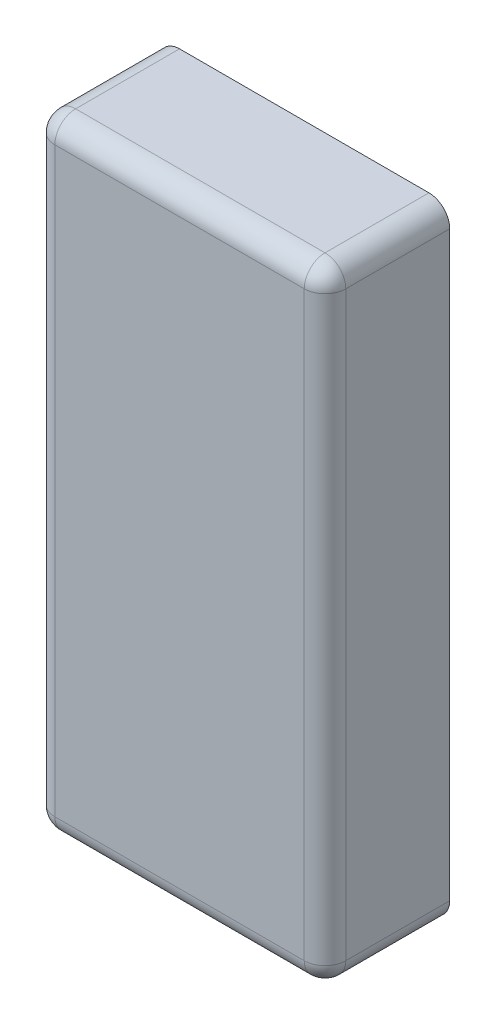
ISO-10303-21;
HEADER;
FILE_DESCRIPTION(('STEP AP214'),'2;1');
FILE_NAME('part.step','',(''),(''),'','','');
FILE_SCHEMA(('AUTOMOTIVE_DESIGN { 1 0 10303 214 1 1 1 1 }'));
ENDSEC;
DATA;
#1=APPLICATION_CONTEXT('core data for automotive mechanical design processes');
#2=APPLICATION_PROTOCOL_DEFINITION('international standard','automotive_design',2000,#1);
#3=PRODUCT_CONTEXT('',#1,'mechanical');
#4=PRODUCT('Part','Part','',(#3));
#5=PRODUCT_RELATED_PRODUCT_CATEGORY('part','',(#4));
#6=PRODUCT_DEFINITION_FORMATION('','',#4);
#7=PRODUCT_DEFINITION_CONTEXT('part definition',#1,'design');
#8=PRODUCT_DEFINITION('design','',#6,#7);
#9=PRODUCT_DEFINITION_SHAPE('','',#8);
#10=(LENGTH_UNIT() NAMED_UNIT(*) SI_UNIT(.MILLI.,.METRE.));
#11=(NAMED_UNIT(*) PLANE_ANGLE_UNIT() SI_UNIT($,.RADIAN.));
#12=(NAMED_UNIT(*) SI_UNIT($,.STERADIAN.) SOLID_ANGLE_UNIT());
#13=UNCERTAINTY_MEASURE_WITH_UNIT(LENGTH_MEASURE(1.E-05),#10,'distance_accuracy_value','');
#14=(GEOMETRIC_REPRESENTATION_CONTEXT(3) GLOBAL_UNCERTAINTY_ASSIGNED_CONTEXT((#13)) GLOBAL_UNIT_ASSIGNED_CONTEXT((#10,
#11,#12)) REPRESENTATION_CONTEXT('',''));
#15=CARTESIAN_POINT('',(0.,0.,0.));
#16=DIRECTION('',(0.,0.,1.));
#17=DIRECTION('',(1.,0.,0.));
#18=AXIS2_PLACEMENT_3D('',#15,#16,#17);
#19=CARTESIAN_POINT('',(9.110692596436,-0.142632293701,2.918495283666E-06));
#20=DIRECTION('',(0.,1.,0.));
#21=DIRECTION('',(1.,0.,0.));
#22=AXIS2_PLACEMENT_3D('',#19,#20,#21);
#23=PLANE('',#22);
#24=DIRECTION('',(1.,0.,0.));
#25=VECTOR('',#24,1.);
#26=CARTESIAN_POINT('',(9.110692596436,-0.142632293701,2.918495283666E-06));
#27=LINE('',#26,#25);
#28=CARTESIAN_POINT('',(9.210692596436,-0.142632293701,2.918495283666E-06));
#29=VERTEX_POINT('',#28);
#30=CARTESIAN_POINT('',(10.410692596436,-0.142632293701,2.918495283666E-06));
#31=VERTEX_POINT('',#30);
#32=EDGE_CURVE('E40',#29,#31,#27,.T.);
#33=ORIENTED_EDGE('',*,*,#32,.F.);
#34=DIRECTION('',(0.,0.,1.));
#35=VECTOR('',#34,1.);
#36=CARTESIAN_POINT('',(9.210692596436,-0.142632293701,2.918495283666E-06));
#37=LINE('',#36,#35);
#38=CARTESIAN_POINT('',(9.210692596436,-0.142632293701,0.500002918495));
#39=VERTEX_POINT('',#38);
#40=EDGE_CURVE('E11',#29,#39,#37,.T.);
#41=ORIENTED_EDGE('',*,*,#40,.T.);
#42=DIRECTION('',(1.,0.,0.));
#43=VECTOR('',#42,1.);
#44=CARTESIAN_POINT('',(9.110692596436,-0.142632293701,0.500002918495));
#45=LINE('',#44,#43);
#46=CARTESIAN_POINT('',(10.410692596436,-0.142632293701,0.500002918495));
#47=VERTEX_POINT('',#46);
#48=EDGE_CURVE('E27',#39,#47,#45,.T.);
#49=ORIENTED_EDGE('',*,*,#48,.T.);
#50=DIRECTION('',(0.,0.,1.));
#51=VECTOR('',#50,1.);
#52=CARTESIAN_POINT('',(10.410692596436,-0.142632293701,2.918495283666E-06));
#53=LINE('',#52,#51);
#54=EDGE_CURVE('E196',#31,#47,#53,.T.);
#55=ORIENTED_EDGE('',*,*,#54,.F.);
#56=EDGE_LOOP('',(#33,#41,#49,#55));
#57=FACE_BOUND('',#56,.T.);
#58=ADVANCED_FACE('F16',(#57),#23,.T.);
#59=CARTESIAN_POINT('',(9.810692596436,-1.642632293701,2.918495283666E-06));
#60=DIRECTION('',(0.,0.,1.));
#61=DIRECTION('',(1.,0.,0.));
#62=AXIS2_PLACEMENT_3D('',#59,#60,#61);
#63=PLANE('',#62);
#64=CARTESIAN_POINT('',(10.410692596436,-0.242632293701,2.918495283666E-06));
#65=DIRECTION('',(0.,0.,-1.));
#66=DIRECTION('',(0.,-1.,0.));
#67=AXIS2_PLACEMENT_3D('',#64,#65,#66);
#68=CIRCLE('',#67,0.1);
#69=CARTESIAN_POINT('',(10.510692596436,-0.242632293701,2.918495283666E-06));
#70=VERTEX_POINT('',#69);
#71=EDGE_CURVE('E235',#31,#70,#68,.T.);
#72=ORIENTED_EDGE('',*,*,#71,.T.);
#73=DIRECTION('',(0.,-1.,0.));
#74=VECTOR('',#73,1.);
#75=CARTESIAN_POINT('',(10.510692596436,-0.142632293701,2.918495283666E-06));
#76=LINE('',#75,#74);
#77=CARTESIAN_POINT('',(10.510692596436,-3.042632293701,2.918495283666E-06));
#78=VERTEX_POINT('',#77);
#79=EDGE_CURVE('E132',#70,#78,#76,.T.);
#80=ORIENTED_EDGE('',*,*,#79,.T.);
#81=CARTESIAN_POINT('',(10.410692596436,-3.042632293701,2.918495283666E-06));
#82=DIRECTION('',(0.,0.,-1.));
#83=DIRECTION('',(0.,-1.,0.));
#84=AXIS2_PLACEMENT_3D('',#81,#82,#83);
#85=CIRCLE('',#84,0.1);
#86=CARTESIAN_POINT('',(10.410692596436,-3.142632293701,2.918495283666E-06));
#87=VERTEX_POINT('',#86);
#88=EDGE_CURVE('E126',#78,#87,#85,.T.);
#89=ORIENTED_EDGE('',*,*,#88,.T.);
#90=DIRECTION('',(-1.,0.,0.));
#91=VECTOR('',#90,1.);
#92=CARTESIAN_POINT('',(10.510692596436,-3.142632293701,2.918495283666E-06));
#93=LINE('',#92,#91);
#94=CARTESIAN_POINT('',(9.210692596436,-3.142632293701,2.918495283666E-06));
#95=VERTEX_POINT('',#94);
#96=EDGE_CURVE('E115',#87,#95,#93,.T.);
#97=ORIENTED_EDGE('',*,*,#96,.T.);
#98=CARTESIAN_POINT('',(9.210692596436,-3.042632293701,2.918495283666E-06));
#99=DIRECTION('',(0.,0.,-1.));
#100=DIRECTION('',(0.,-1.,0.));
#101=AXIS2_PLACEMENT_3D('',#98,#99,#100);
#102=CIRCLE('',#101,0.1);
#103=CARTESIAN_POINT('',(9.110692596436,-3.042632293701,2.918495283666E-06));
#104=VERTEX_POINT('',#103);
#105=EDGE_CURVE('E127',#95,#104,#102,.T.);
#106=ORIENTED_EDGE('',*,*,#105,.T.);
#107=DIRECTION('',(0.,1.,0.));
#108=VECTOR('',#107,1.);
#109=CARTESIAN_POINT('',(9.110692596436,-3.142632293701,2.918495283666E-06));
#110=LINE('',#109,#108);
#111=CARTESIAN_POINT('',(9.110692596436,-0.242632293701,2.918495283666E-06));
#112=VERTEX_POINT('',#111);
#113=EDGE_CURVE('E190',#104,#112,#110,.T.);
#114=ORIENTED_EDGE('',*,*,#113,.T.);
#115=CARTESIAN_POINT('',(9.210692596436,-0.242632293701,2.918495283666E-06));
#116=DIRECTION('',(0.,0.,1.));
#117=DIRECTION('',(0.,-1.,0.));
#118=AXIS2_PLACEMENT_3D('',#115,#116,#117);
#119=CIRCLE('',#118,0.1);
#120=EDGE_CURVE('E195',#29,#112,#119,.T.);
#121=ORIENTED_EDGE('',*,*,#120,.F.);
#122=ORIENTED_EDGE('',*,*,#32,.T.);
#123=EDGE_LOOP('',(#72,#80,#89,#97,#106,#114,#121,#122));
#124=FACE_BOUND('',#123,.T.);
#125=ADVANCED_FACE('F131',(#124),#63,.F.);
#126=CARTESIAN_POINT('',(9.210692596436,-0.242632293701,2.918495283666E-06));
#127=DIRECTION('',(0.,0.,1.));
#128=DIRECTION('',(0.,1.,0.));
#129=AXIS2_PLACEMENT_3D('',#126,#127,#128);
#130=CYLINDRICAL_SURFACE('',#129,0.1);
#131=ORIENTED_EDGE('',*,*,#120,.T.);
#132=DIRECTION('',(0.,0.,1.));
#133=VECTOR('',#132,1.);
#134=CARTESIAN_POINT('',(9.110692596436,-0.242632293701,2.918495283666E-06));
#135=LINE('',#134,#133);
#136=CARTESIAN_POINT('',(9.110692596436,-0.242632293701,0.500002918495));
#137=VERTEX_POINT('',#136);
#138=EDGE_CURVE('E191',#112,#137,#135,.T.);
#139=ORIENTED_EDGE('',*,*,#138,.T.);
#140=CARTESIAN_POINT('',(9.210692596436,-0.242632293701,0.500002918495));
#141=DIRECTION('',(0.,0.,1.));
#142=DIRECTION('',(0.,1.,0.));
#143=AXIS2_PLACEMENT_3D('',#140,#141,#142);
#144=CIRCLE('',#143,0.1);
#145=EDGE_CURVE('E152',#39,#137,#144,.T.);
#146=ORIENTED_EDGE('',*,*,#145,.F.);
#147=ORIENTED_EDGE('',*,*,#40,.F.);
#148=EDGE_LOOP('',(#131,#139,#146,#147));
#149=FACE_BOUND('',#148,.T.);
#150=ADVANCED_FACE('F352',(#149),#130,.T.);
#151=CARTESIAN_POINT('',(10.410692596436,-0.242632293701,2.918495283666E-06));
#152=DIRECTION('',(0.,0.,1.));
#153=DIRECTION('',(0.,1.,0.));
#154=AXIS2_PLACEMENT_3D('',#151,#152,#153);
#155=CYLINDRICAL_SURFACE('',#154,0.1);
#156=ORIENTED_EDGE('',*,*,#54,.T.);
#157=CARTESIAN_POINT('',(10.410692596436,-0.242632293701,0.500002918495));
#158=DIRECTION('',(0.,0.,1.));
#159=DIRECTION('',(0.,1.,0.));
#160=AXIS2_PLACEMENT_3D('',#157,#158,#159);
#161=CIRCLE('',#160,0.1);
#162=CARTESIAN_POINT('',(10.510692596436,-0.242632293701,0.500002918495));
#163=VERTEX_POINT('',#162);
#164=EDGE_CURVE('E161',#163,#47,#161,.T.);
#165=ORIENTED_EDGE('',*,*,#164,.F.);
#166=DIRECTION('',(0.,0.,1.));
#167=VECTOR('',#166,1.);
#168=CARTESIAN_POINT('',(10.510692596436,-0.242632293701,2.918495283666E-06));
#169=LINE('',#168,#167);
#170=EDGE_CURVE('E20',#70,#163,#169,.T.);
#171=ORIENTED_EDGE('',*,*,#170,.F.);
#172=ORIENTED_EDGE('',*,*,#71,.F.);
#173=EDGE_LOOP('',(#156,#165,#171,#172));
#174=FACE_BOUND('',#173,.T.);
#175=ADVANCED_FACE('F272',(#174),#155,.T.);
#176=CARTESIAN_POINT('',(9.110692596436,-0.242632293701,0.500002918495));
#177=DIRECTION('',(1.,0.,0.));
#178=DIRECTION('',(0.,1.,0.));
#179=AXIS2_PLACEMENT_3D('',#176,#177,#178);
#180=CYLINDRICAL_SURFACE('',#179,0.1);
#181=CARTESIAN_POINT('',(9.210692596436,-0.242632293701,0.500002918495));
#182=DIRECTION('',(-1.,0.,0.));
#183=DIRECTION('',(0.,1.,0.));
#184=AXIS2_PLACEMENT_3D('',#181,#182,#183);
#185=CIRCLE('',#184,0.1);
#186=CARTESIAN_POINT('',(9.210692596436,-0.242632293701,0.600002918495));
#187=VERTEX_POINT('',#186);
#188=EDGE_CURVE('E160',#187,#39,#185,.T.);
#189=ORIENTED_EDGE('',*,*,#188,.F.);
#190=DIRECTION('',(1.,0.,0.));
#191=VECTOR('',#190,1.);
#192=CARTESIAN_POINT('',(9.110692596436,-0.242632293701,0.600002918495));
#193=LINE('',#192,#191);
#194=CARTESIAN_POINT('',(10.410692596436,-0.242632293701,0.600002918495));
#195=VERTEX_POINT('',#194);
#196=EDGE_CURVE('E209',#187,#195,#193,.T.);
#197=ORIENTED_EDGE('',*,*,#196,.T.);
#198=CARTESIAN_POINT('',(10.410692596436,-0.242632293701,0.500002918495));
#199=DIRECTION('',(1.,0.,0.));
#200=DIRECTION('',(0.,1.,0.));
#201=AXIS2_PLACEMENT_3D('',#198,#199,#200);
#202=CIRCLE('',#201,0.1);
#203=EDGE_CURVE('E157',#47,#195,#202,.T.);
#204=ORIENTED_EDGE('',*,*,#203,.F.);
#205=ORIENTED_EDGE('',*,*,#48,.F.);
#206=EDGE_LOOP('',(#189,#197,#204,#205));
#207=FACE_BOUND('',#206,.T.);
#208=ADVANCED_FACE('F18',(#207),#180,.T.);
#209=CARTESIAN_POINT('',(9.110692596436,-3.142632293701,2.918495283666E-06));
#210=DIRECTION('',(-1.,0.,0.));
#211=DIRECTION('',(0.,0.,1.));
#212=AXIS2_PLACEMENT_3D('',#209,#210,#211);
#213=PLANE('',#212);
#214=ORIENTED_EDGE('',*,*,#113,.F.);
#215=DIRECTION('',(0.,0.,1.));
#216=VECTOR('',#215,1.);
#217=CARTESIAN_POINT('',(9.110692596436,-3.042632293701,2.918495283666E-06));
#218=LINE('',#217,#216);
#219=CARTESIAN_POINT('',(9.110692596436,-3.042632293701,0.500002918495));
#220=VERTEX_POINT('',#219);
#221=EDGE_CURVE('E206',#104,#220,#218,.T.);
#222=ORIENTED_EDGE('',*,*,#221,.T.);
#223=DIRECTION('',(0.,1.,0.));
#224=VECTOR('',#223,1.);
#225=CARTESIAN_POINT('',(9.110692596436,-3.142632293701,0.500002918495));
#226=LINE('',#225,#224);
#227=EDGE_CURVE('E210',#220,#137,#226,.T.);
#228=ORIENTED_EDGE('',*,*,#227,.T.);
#229=ORIENTED_EDGE('',*,*,#138,.F.);
#230=EDGE_LOOP('',(#214,#222,#228,#229));
#231=FACE_BOUND('',#230,.T.);
#232=ADVANCED_FACE('F298',(#231),#213,.T.);
#233=CARTESIAN_POINT('',(10.510692596436,-0.142632293701,2.918495283666E-06));
#234=DIRECTION('',(1.,0.,0.));
#235=DIRECTION('',(0.,1.,0.));
#236=AXIS2_PLACEMENT_3D('',#233,#234,#235);
#237=PLANE('',#236);
#238=ORIENTED_EDGE('',*,*,#79,.F.);
#239=ORIENTED_EDGE('',*,*,#170,.T.);
#240=DIRECTION('',(0.,-1.,0.));
#241=VECTOR('',#240,1.);
#242=CARTESIAN_POINT('',(10.510692596436,-0.142632293701,0.500002918495));
#243=LINE('',#242,#241);
#244=CARTESIAN_POINT('',(10.510692596436,-3.042632293701,0.500002918495));
#245=VERTEX_POINT('',#244);
#246=EDGE_CURVE('E169',#163,#245,#243,.T.);
#247=ORIENTED_EDGE('',*,*,#246,.T.);
#248=DIRECTION('',(0.,0.,1.));
#249=VECTOR('',#248,1.);
#250=CARTESIAN_POINT('',(10.510692596436,-3.042632293701,2.918495283666E-06));
#251=LINE('',#250,#249);
#252=EDGE_CURVE('E142',#78,#245,#251,.T.);
#253=ORIENTED_EDGE('',*,*,#252,.F.);
#254=EDGE_LOOP('',(#238,#239,#247,#253));
#255=FACE_BOUND('',#254,.T.);
#256=ADVANCED_FACE('F282',(#255),#237,.T.);
#257=CARTESIAN_POINT('',(9.210692596436,-3.042632293701,2.918495283666E-06));
#258=DIRECTION('',(0.,0.,1.));
#259=DIRECTION('',(0.,-1.,0.));
#260=AXIS2_PLACEMENT_3D('',#257,#258,#259);
#261=CYLINDRICAL_SURFACE('',#260,0.1);
#262=DIRECTION('',(0.,0.,1.));
#263=VECTOR('',#262,1.);
#264=CARTESIAN_POINT('',(9.210692596436,-3.142632293701,2.918495283666E-06));
#265=LINE('',#264,#263);
#266=CARTESIAN_POINT('',(9.210692596436,-3.142632293701,0.500002918495));
#267=VERTEX_POINT('',#266);
#268=EDGE_CURVE('E122',#95,#267,#265,.T.);
#269=ORIENTED_EDGE('',*,*,#268,.T.);
#270=CARTESIAN_POINT('',(9.210692596436,-3.042632293701,0.500002918495));
#271=DIRECTION('',(0.,0.,-1.));
#272=DIRECTION('',(-1.,0.,0.));
#273=AXIS2_PLACEMENT_3D('',#270,#271,#272);
#274=CIRCLE('',#273,0.1);
#275=EDGE_CURVE('E149',#267,#220,#274,.T.);
#276=ORIENTED_EDGE('',*,*,#275,.T.);
#277=ORIENTED_EDGE('',*,*,#221,.F.);
#278=ORIENTED_EDGE('',*,*,#105,.F.);
#279=EDGE_LOOP('',(#269,#276,#277,#278));
#280=FACE_BOUND('',#279,.T.);
#281=ADVANCED_FACE('F324',(#280),#261,.T.);
#282=CARTESIAN_POINT('',(10.410692596436,-3.042632293701,2.918495283666E-06));
#283=DIRECTION('',(0.,0.,1.));
#284=DIRECTION('',(1.,0.,0.));
#285=AXIS2_PLACEMENT_3D('',#282,#283,#284);
#286=CYLINDRICAL_SURFACE('',#285,0.1);
#287=ORIENTED_EDGE('',*,*,#252,.T.);
#288=CARTESIAN_POINT('',(10.410692596436,-3.042632293701,0.500002918495));
#289=DIRECTION('',(0.,0.,1.));
#290=DIRECTION('',(1.,0.,0.));
#291=AXIS2_PLACEMENT_3D('',#288,#289,#290);
#292=CIRCLE('',#291,0.1);
#293=CARTESIAN_POINT('',(10.410692596436,-3.142632293701,0.500002918495));
#294=VERTEX_POINT('',#293);
#295=EDGE_CURVE('E139',#294,#245,#292,.T.);
#296=ORIENTED_EDGE('',*,*,#295,.F.);
#297=DIRECTION('',(0.,0.,1.));
#298=VECTOR('',#297,1.);
#299=CARTESIAN_POINT('',(10.410692596436,-3.142632293701,2.918495283666E-06));
#300=LINE('',#299,#298);
#301=EDGE_CURVE('E119',#87,#294,#300,.T.);
#302=ORIENTED_EDGE('',*,*,#301,.F.);
#303=ORIENTED_EDGE('',*,*,#88,.F.);
#304=EDGE_LOOP('',(#287,#296,#302,#303));
#305=FACE_BOUND('',#304,.T.);
#306=ADVANCED_FACE('F138',(#305),#286,.T.);
#307=CARTESIAN_POINT('',(10.510692596436,-3.142632293701,2.918495283666E-06));
#308=DIRECTION('',(0.,-1.,0.));
#309=DIRECTION('',(0.,0.,-1.));
#310=AXIS2_PLACEMENT_3D('',#307,#308,#309);
#311=PLANE('',#310);
#312=ORIENTED_EDGE('',*,*,#96,.F.);
#313=ORIENTED_EDGE('',*,*,#301,.T.);
#314=DIRECTION('',(-1.,0.,0.));
#315=VECTOR('',#314,1.);
#316=CARTESIAN_POINT('',(10.510692596436,-3.142632293701,0.500002918495));
#317=LINE('',#316,#315);
#318=EDGE_CURVE('E143',#294,#267,#317,.T.);
#319=ORIENTED_EDGE('',*,*,#318,.T.);
#320=ORIENTED_EDGE('',*,*,#268,.F.);
#321=EDGE_LOOP('',(#312,#313,#319,#320));
#322=FACE_BOUND('',#321,.T.);
#323=ADVANCED_FACE('F117',(#322),#311,.T.);
#324=CARTESIAN_POINT('',(9.210692596436,-0.242632293701,0.500002918495));
#325=DIRECTION('',(0.,0.,-1.));
#326=DIRECTION('',(0.,1.,0.));
#327=AXIS2_PLACEMENT_3D('',#324,#325,#326);
#328=SPHERICAL_SURFACE('',#327,0.1);
#329=ORIENTED_EDGE('',*,*,#145,.T.);
#330=CARTESIAN_POINT('',(9.210692596436,-0.242632293701,0.500002918495));
#331=DIRECTION('',(0.,-1.,0.));
#332=DIRECTION('',(-1.,0.,0.));
#333=AXIS2_PLACEMENT_3D('',#330,#331,#332);
#334=CIRCLE('',#333,0.1);
#335=EDGE_CURVE('E167',#187,#137,#334,.T.);
#336=ORIENTED_EDGE('',*,*,#335,.F.);
#337=ORIENTED_EDGE('',*,*,#188,.T.);
#338=EDGE_LOOP('',(#329,#336,#337));
#339=FACE_BOUND('',#338,.T.);
#340=ADVANCED_FACE('F311',(#339),#328,.T.);
#341=CARTESIAN_POINT('',(10.410692596436,-0.242632293701,0.500002918495));
#342=DIRECTION('',(-1.,0.,0.));
#343=DIRECTION('',(0.,1.,0.));
#344=AXIS2_PLACEMENT_3D('',#341,#342,#343);
#345=SPHERICAL_SURFACE('',#344,0.1);
#346=ORIENTED_EDGE('',*,*,#203,.T.);
#347=CARTESIAN_POINT('',(10.410692596436,-0.242632293701,0.500002918495));
#348=DIRECTION('',(0.,-1.,0.));
#349=DIRECTION('',(0.,0.,1.));
#350=AXIS2_PLACEMENT_3D('',#347,#348,#349);
#351=CIRCLE('',#350,0.1);
#352=EDGE_CURVE('E164',#163,#195,#351,.T.);
#353=ORIENTED_EDGE('',*,*,#352,.F.);
#354=ORIENTED_EDGE('',*,*,#164,.T.);
#355=EDGE_LOOP('',(#346,#353,#354));
#356=FACE_BOUND('',#355,.T.);
#357=ADVANCED_FACE('F278',(#356),#345,.T.);
#358=CARTESIAN_POINT('',(9.810692596436,-1.642632293701,0.600002918495));
#359=DIRECTION('',(0.,0.,1.));
#360=DIRECTION('',(1.,0.,0.));
#361=AXIS2_PLACEMENT_3D('',#358,#359,#360);
#362=PLANE('',#361);
#363=ORIENTED_EDGE('',*,*,#196,.F.);
#364=DIRECTION('',(0.,1.,0.));
#365=VECTOR('',#364,1.);
#366=CARTESIAN_POINT('',(9.210692596436,-3.142632293701,0.600002918495));
#367=LINE('',#366,#365);
#368=CARTESIAN_POINT('',(9.210692596436,-3.042632293701,0.600002918495));
#369=VERTEX_POINT('',#368);
#370=EDGE_CURVE('E180',#369,#187,#367,.T.);
#371=ORIENTED_EDGE('',*,*,#370,.F.);
#372=DIRECTION('',(-1.,0.,0.));
#373=VECTOR('',#372,1.);
#374=CARTESIAN_POINT('',(10.510692596436,-3.042632293701,0.600002918495));
#375=LINE('',#374,#373);
#376=CARTESIAN_POINT('',(10.410692596436,-3.042632293701,0.600002918495));
#377=VERTEX_POINT('',#376);
#378=EDGE_CURVE('E199',#377,#369,#375,.T.);
#379=ORIENTED_EDGE('',*,*,#378,.F.);
#380=DIRECTION('',(0.,-1.,0.));
#381=VECTOR('',#380,1.);
#382=CARTESIAN_POINT('',(10.410692596436,-0.142632293701,0.600002918495));
#383=LINE('',#382,#381);
#384=EDGE_CURVE('E168',#195,#377,#383,.T.);
#385=ORIENTED_EDGE('',*,*,#384,.F.);
#386=EDGE_LOOP('',(#363,#371,#379,#385));
#387=FACE_BOUND('',#386,.T.);
#388=ADVANCED_FACE('F336',(#387),#362,.T.);
#389=CARTESIAN_POINT('',(9.210692596436,-3.142632293701,0.500002918495));
#390=DIRECTION('',(0.,1.,0.));
#391=DIRECTION('',(-1.,0.,0.));
#392=AXIS2_PLACEMENT_3D('',#389,#390,#391);
#393=CYLINDRICAL_SURFACE('',#392,0.1);
#394=ORIENTED_EDGE('',*,*,#227,.F.);
#395=CARTESIAN_POINT('',(9.210692596436,-3.042632293701,0.500002918495));
#396=DIRECTION('',(0.,-1.,0.));
#397=DIRECTION('',(0.,0.,1.));
#398=AXIS2_PLACEMENT_3D('',#395,#396,#397);
#399=CIRCLE('',#398,0.1);
#400=EDGE_CURVE('E204',#369,#220,#399,.T.);
#401=ORIENTED_EDGE('',*,*,#400,.F.);
#402=ORIENTED_EDGE('',*,*,#370,.T.);
#403=ORIENTED_EDGE('',*,*,#335,.T.);
#404=EDGE_LOOP('',(#394,#401,#402,#403));
#405=FACE_BOUND('',#404,.T.);
#406=ADVANCED_FACE('F341',(#405),#393,.T.);
#407=CARTESIAN_POINT('',(10.410692596436,-0.142632293701,0.500002918495));
#408=DIRECTION('',(0.,-1.,0.));
#409=DIRECTION('',(1.,0.,0.));
#410=AXIS2_PLACEMENT_3D('',#407,#408,#409);
#411=CYLINDRICAL_SURFACE('',#410,0.1);
#412=ORIENTED_EDGE('',*,*,#352,.T.);
#413=ORIENTED_EDGE('',*,*,#384,.T.);
#414=CARTESIAN_POINT('',(10.410692596436,-3.042632293701,0.500002918495));
#415=DIRECTION('',(0.,1.,0.));
#416=DIRECTION('',(0.,0.,1.));
#417=AXIS2_PLACEMENT_3D('',#414,#415,#416);
#418=CIRCLE('',#417,0.1);
#419=EDGE_CURVE('E213',#377,#245,#418,.T.);
#420=ORIENTED_EDGE('',*,*,#419,.T.);
#421=ORIENTED_EDGE('',*,*,#246,.F.);
#422=EDGE_LOOP('',(#412,#413,#420,#421));
#423=FACE_BOUND('',#422,.T.);
#424=ADVANCED_FACE('F279',(#423),#411,.T.);
#425=CARTESIAN_POINT('',(9.210692596436,-3.042632293701,0.500002918495));
#426=DIRECTION('',(0.,1.,0.));
#427=DIRECTION('',(0.,0.,1.));
#428=AXIS2_PLACEMENT_3D('',#425,#426,#427);
#429=SPHERICAL_SURFACE('',#428,0.1);
#430=ORIENTED_EDGE('',*,*,#400,.T.);
#431=ORIENTED_EDGE('',*,*,#275,.F.);
#432=CARTESIAN_POINT('',(9.210692596436,-3.042632293701,0.500002918495));
#433=DIRECTION('',(-1.,0.,0.));
#434=DIRECTION('',(0.,0.,1.));
#435=AXIS2_PLACEMENT_3D('',#432,#433,#434);
#436=CIRCLE('',#435,0.1);
#437=EDGE_CURVE('E182',#267,#369,#436,.T.);
#438=ORIENTED_EDGE('',*,*,#437,.T.);
#439=EDGE_LOOP('',(#430,#431,#438));
#440=FACE_BOUND('',#439,.T.);
#441=ADVANCED_FACE('F363',(#440),#429,.T.);
#442=CARTESIAN_POINT('',(10.410692596436,-3.042632293701,0.500002918495));
#443=DIRECTION('',(0.,1.,0.));
#444=DIRECTION('',(0.,0.,1.));
#445=AXIS2_PLACEMENT_3D('',#442,#443,#444);
#446=SPHERICAL_SURFACE('',#445,0.1);
#447=CARTESIAN_POINT('',(10.410692596436,-3.042632293701,0.500002918495));
#448=DIRECTION('',(-1.,0.,0.));
#449=DIRECTION('',(0.,0.,1.));
#450=AXIS2_PLACEMENT_3D('',#447,#448,#449);
#451=CIRCLE('',#450,0.1);
#452=EDGE_CURVE('E183',#294,#377,#451,.T.);
#453=ORIENTED_EDGE('',*,*,#452,.F.);
#454=ORIENTED_EDGE('',*,*,#295,.T.);
#455=ORIENTED_EDGE('',*,*,#419,.F.);
#456=EDGE_LOOP('',(#453,#454,#455));
#457=FACE_BOUND('',#456,.T.);
#458=ADVANCED_FACE('F399',(#457),#446,.T.);
#459=CARTESIAN_POINT('',(10.510692596436,-3.042632293701,0.500002918495));
#460=DIRECTION('',(-1.,0.,0.));
#461=DIRECTION('',(0.,-1.,0.));
#462=AXIS2_PLACEMENT_3D('',#459,#460,#461);
#463=CYLINDRICAL_SURFACE('',#462,0.1);
#464=ORIENTED_EDGE('',*,*,#452,.T.);
#465=ORIENTED_EDGE('',*,*,#378,.T.);
#466=ORIENTED_EDGE('',*,*,#437,.F.);
#467=ORIENTED_EDGE('',*,*,#318,.F.);
#468=EDGE_LOOP('',(#464,#465,#466,#467));
#469=FACE_BOUND('',#468,.T.);
#470=ADVANCED_FACE('F417',(#469),#463,.T.);
#471=CLOSED_SHELL('',(#58,#125,#150,#175,#208,#232,#256,#281,#306,#323,#340,#357,#388,#406,#424,
#441,#458,#470));
#472=MANIFOLD_SOLID_BREP('B1',#471);
#473=ADVANCED_BREP_SHAPE_REPRESENTATION('',(#18,#472),#14);
#474=SHAPE_DEFINITION_REPRESENTATION(#9,#473);
ENDSEC;
END-ISO-10303-21;
